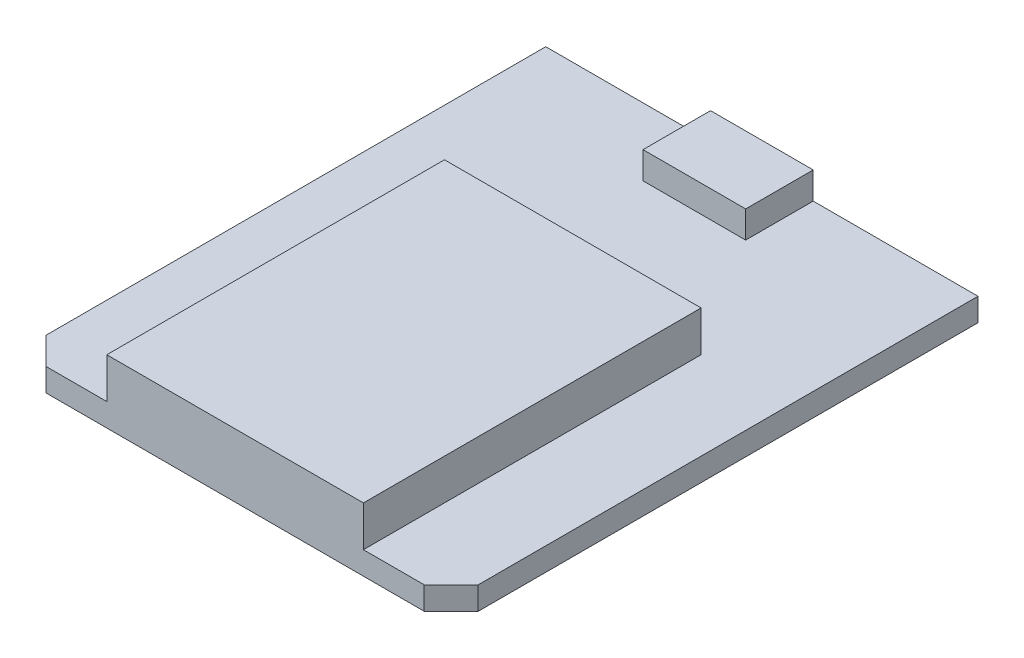
ISO-10303-21;
HEADER;
FILE_DESCRIPTION(('STEP AP214'),'2;1');
FILE_NAME('part.step','',(''),(''),'','','');
FILE_SCHEMA(('AUTOMOTIVE_DESIGN { 1 0 10303 214 1 1 1 1 }'));
ENDSEC;
DATA;
#1=APPLICATION_CONTEXT('core data for automotive mechanical design processes');
#2=APPLICATION_PROTOCOL_DEFINITION('international standard','automotive_design',2000,#1);
#3=PRODUCT_CONTEXT('',#1,'mechanical');
#4=PRODUCT('Part','Part','',(#3));
#5=PRODUCT_RELATED_PRODUCT_CATEGORY('part','',(#4));
#6=PRODUCT_DEFINITION_FORMATION('','',#4);
#7=PRODUCT_DEFINITION_CONTEXT('part definition',#1,'design');
#8=PRODUCT_DEFINITION('design','',#6,#7);
#9=PRODUCT_DEFINITION_SHAPE('','',#8);
#10=(LENGTH_UNIT() NAMED_UNIT(*) SI_UNIT(.MILLI.,.METRE.));
#11=(NAMED_UNIT(*) PLANE_ANGLE_UNIT() SI_UNIT($,.RADIAN.));
#12=(NAMED_UNIT(*) SI_UNIT($,.STERADIAN.) SOLID_ANGLE_UNIT());
#13=UNCERTAINTY_MEASURE_WITH_UNIT(LENGTH_MEASURE(1.E-05),#10,'distance_accuracy_value','');
#14=(GEOMETRIC_REPRESENTATION_CONTEXT(3) GLOBAL_UNCERTAINTY_ASSIGNED_CONTEXT((#13)) GLOBAL_UNIT_ASSIGNED_CONTEXT((#10,
#11,#12)) REPRESENTATION_CONTEXT('',''));
#15=CARTESIAN_POINT('',(0.,0.,0.));
#16=DIRECTION('',(0.,0.,1.));
#17=DIRECTION('',(1.,0.,0.));
#18=AXIS2_PLACEMENT_3D('',#15,#16,#17);
#19=CARTESIAN_POINT('',(0.,1.7,0.));
#20=DIRECTION('',(0.,-1.,0.));
#21=DIRECTION('',(0.,0.,-1.));
#22=AXIS2_PLACEMENT_3D('',#19,#20,#21);
#23=PLANE('',#22);
#24=DIRECTION('',(0.,0.,1.));
#25=VECTOR('',#24,1.);
#26=CARTESIAN_POINT('',(12.2,1.7,-39.));
#27=LINE('',#26,#25);
#28=CARTESIAN_POINT('',(12.2,1.7,-39.));
#29=VERTEX_POINT('',#28);
#30=CARTESIAN_POINT('',(12.2,1.7,-34.));
#31=VERTEX_POINT('',#30);
#32=EDGE_CURVE('E162',#29,#31,#27,.T.);
#33=ORIENTED_EDGE('',*,*,#32,.F.);
#34=DIRECTION('',(-1.,0.,0.));
#35=VECTOR('',#34,1.);
#36=CARTESIAN_POINT('',(0.,1.7,-39.));
#37=LINE('',#36,#35);
#38=CARTESIAN_POINT('',(0.,1.7,-39.));
#39=VERTEX_POINT('',#38);
#40=EDGE_CURVE('E208',#29,#39,#37,.T.);
#41=ORIENTED_EDGE('',*,*,#40,.T.);
#42=DIRECTION('',(0.,0.,1.));
#43=VECTOR('',#42,1.);
#44=CARTESIAN_POINT('',(0.,1.7,0.));
#45=LINE('',#44,#43);
#46=CARTESIAN_POINT('',(0.,1.7,-2.00000000000001));
#47=VERTEX_POINT('',#46);
#48=EDGE_CURVE('E199',#39,#47,#45,.T.);
#49=ORIENTED_EDGE('',*,*,#48,.T.);
#50=DIRECTION('',(-0.707106781186546,0.,-0.707106781186549));
#51=VECTOR('',#50,1.);
#52=CARTESIAN_POINT('',(2.,1.7,0.));
#53=LINE('',#52,#51);
#54=CARTESIAN_POINT('',(2.,1.7,0.));
#55=VERTEX_POINT('',#54);
#56=EDGE_CURVE('E238',#47,#55,#53,.F.);
#57=ORIENTED_EDGE('',*,*,#56,.T.);
#58=DIRECTION('',(1.,0.,0.));
#59=VECTOR('',#58,1.);
#60=CARTESIAN_POINT('',(0.,1.7,0.));
#61=LINE('',#60,#59);
#62=CARTESIAN_POINT('',(6.49999999999999,1.7,0.));
#63=VERTEX_POINT('',#62);
#64=EDGE_CURVE('E204',#55,#63,#61,.T.);
#65=ORIENTED_EDGE('',*,*,#64,.T.);
#66=DIRECTION('',(0.,0.,1.));
#67=VECTOR('',#66,1.);
#68=CARTESIAN_POINT('',(6.49999999999999,1.7,0.));
#69=LINE('',#68,#67);
#70=CARTESIAN_POINT('',(6.49999999999999,1.7,-25.));
#71=VERTEX_POINT('',#70);
#72=EDGE_CURVE('E163',#71,#63,#69,.T.);
#73=ORIENTED_EDGE('',*,*,#72,.F.);
#74=DIRECTION('',(-1.,0.,0.));
#75=VECTOR('',#74,1.);
#76=CARTESIAN_POINT('',(6.49999999999999,1.7,-25.));
#77=LINE('',#76,#75);
#78=CARTESIAN_POINT('',(25.5,1.7,-25.));
#79=VERTEX_POINT('',#78);
#80=EDGE_CURVE('E176',#79,#71,#77,.T.);
#81=ORIENTED_EDGE('',*,*,#80,.F.);
#82=DIRECTION('',(0.,0.,-1.));
#83=VECTOR('',#82,1.);
#84=CARTESIAN_POINT('',(25.5,1.7,0.));
#85=LINE('',#84,#83);
#86=CARTESIAN_POINT('',(25.5,1.7,0.));
#87=VERTEX_POINT('',#86);
#88=EDGE_CURVE('E166',#87,#79,#85,.T.);
#89=ORIENTED_EDGE('',*,*,#88,.F.);
#90=CARTESIAN_POINT('',(30.,1.7,0.));
#91=VERTEX_POINT('',#90);
#92=EDGE_CURVE('E202',#87,#91,#61,.T.);
#93=ORIENTED_EDGE('',*,*,#92,.T.);
#94=DIRECTION('',(-0.707106781186549,0.,0.707106781186546));
#95=VECTOR('',#94,1.);
#96=CARTESIAN_POINT('',(32.,1.7,-2.));
#97=LINE('',#96,#95);
#98=CARTESIAN_POINT('',(32.,1.7,-2.));
#99=VERTEX_POINT('',#98);
#100=EDGE_CURVE('E50',#91,#99,#97,.F.);
#101=ORIENTED_EDGE('',*,*,#100,.T.);
#102=DIRECTION('',(0.,0.,-1.));
#103=VECTOR('',#102,1.);
#104=CARTESIAN_POINT('',(32.,1.7,0.));
#105=LINE('',#104,#103);
#106=CARTESIAN_POINT('',(32.,1.7,-39.));
#107=VERTEX_POINT('',#106);
#108=EDGE_CURVE('E206',#99,#107,#105,.T.);
#109=ORIENTED_EDGE('',*,*,#108,.T.);
#110=CARTESIAN_POINT('',(19.8,1.7,-39.));
#111=VERTEX_POINT('',#110);
#112=EDGE_CURVE('E209',#107,#111,#37,.T.);
#113=ORIENTED_EDGE('',*,*,#112,.T.);
#114=DIRECTION('',(0.,0.,-1.));
#115=VECTOR('',#114,1.);
#116=CARTESIAN_POINT('',(19.8,1.7,-39.));
#117=LINE('',#116,#115);
#118=CARTESIAN_POINT('',(19.8,1.7,-34.));
#119=VERTEX_POINT('',#118);
#120=EDGE_CURVE('E62',#119,#111,#117,.T.);
#121=ORIENTED_EDGE('',*,*,#120,.F.);
#122=DIRECTION('',(1.,0.,0.));
#123=VECTOR('',#122,1.);
#124=CARTESIAN_POINT('',(12.2,1.7,-34.));
#125=LINE('',#124,#123);
#126=EDGE_CURVE('E57',#31,#119,#125,.T.);
#127=ORIENTED_EDGE('',*,*,#126,.F.);
#128=EDGE_LOOP('',(#33,#41,#49,#57,#65,#73,#81,#89,#93,#101,#109,#113,#121,#127));
#129=FACE_BOUND('',#128,.T.);
#130=ADVANCED_FACE('F41',(#129),#23,.F.);
#131=CARTESIAN_POINT('',(0.,1.7,0.));
#132=DIRECTION('',(1.,0.,0.));
#133=DIRECTION('',(0.,0.,-1.));
#134=AXIS2_PLACEMENT_3D('',#131,#132,#133);
#135=PLANE('',#134);
#136=DIRECTION('',(0.,0.,1.));
#137=VECTOR('',#136,1.);
#138=CARTESIAN_POINT('',(0.,0.,0.));
#139=LINE('',#138,#137);
#140=CARTESIAN_POINT('',(0.,0.,-39.));
#141=VERTEX_POINT('',#140);
#142=CARTESIAN_POINT('',(0.,0.,-2.00000000000001));
#143=VERTEX_POINT('',#142);
#144=EDGE_CURVE('E198',#141,#143,#139,.T.);
#145=ORIENTED_EDGE('',*,*,#144,.T.);
#146=DIRECTION('',(0.,1.,0.));
#147=VECTOR('',#146,1.);
#148=CARTESIAN_POINT('',(0.,1.7,-2.00000000000001));
#149=LINE('',#148,#147);
#150=EDGE_CURVE('E11',#143,#47,#149,.T.);
#151=ORIENTED_EDGE('',*,*,#150,.T.);
#152=ORIENTED_EDGE('',*,*,#48,.F.);
#153=DIRECTION('',(0.,-1.,0.));
#154=VECTOR('',#153,1.);
#155=CARTESIAN_POINT('',(0.,1.7,-39.));
#156=LINE('',#155,#154);
#157=EDGE_CURVE('E211',#39,#141,#156,.T.);
#158=ORIENTED_EDGE('',*,*,#157,.T.);
#159=EDGE_LOOP('',(#145,#151,#152,#158));
#160=FACE_BOUND('',#159,.T.);
#161=ADVANCED_FACE('F264',(#160),#135,.F.);
#162=CARTESIAN_POINT('',(0.,1.7,0.));
#163=DIRECTION('',(0.,0.,-1.));
#164=DIRECTION('',(-1.,0.,0.));
#165=AXIS2_PLACEMENT_3D('',#162,#163,#164);
#166=PLANE('',#165);
#167=DIRECTION('',(1.,0.,0.));
#168=VECTOR('',#167,1.);
#169=CARTESIAN_POINT('',(0.,0.,0.));
#170=LINE('',#169,#168);
#171=CARTESIAN_POINT('',(2.,0.,0.));
#172=VERTEX_POINT('',#171);
#173=CARTESIAN_POINT('',(30.,0.,0.));
#174=VERTEX_POINT('',#173);
#175=EDGE_CURVE('E214',#172,#174,#170,.T.);
#176=ORIENTED_EDGE('',*,*,#175,.T.);
#177=DIRECTION('',(0.,1.,0.));
#178=VECTOR('',#177,1.);
#179=CARTESIAN_POINT('',(30.,1.7,0.));
#180=LINE('',#179,#178);
#181=EDGE_CURVE('E235',#174,#91,#180,.T.);
#182=ORIENTED_EDGE('',*,*,#181,.T.);
#183=ORIENTED_EDGE('',*,*,#92,.F.);
#184=DIRECTION('',(0.,-1.,0.));
#185=VECTOR('',#184,1.);
#186=CARTESIAN_POINT('',(25.5,4.7,0.));
#187=LINE('',#186,#185);
#188=CARTESIAN_POINT('',(25.5,4.7,0.));
#189=VERTEX_POINT('',#188);
#190=EDGE_CURVE('E192',#189,#87,#187,.T.);
#191=ORIENTED_EDGE('',*,*,#190,.F.);
#192=DIRECTION('',(1.,0.,0.));
#193=VECTOR('',#192,1.);
#194=CARTESIAN_POINT('',(6.49999999999999,4.7,0.));
#195=LINE('',#194,#193);
#196=CARTESIAN_POINT('',(6.49999999999999,4.7,0.));
#197=VERTEX_POINT('',#196);
#198=EDGE_CURVE('E175',#197,#189,#195,.T.);
#199=ORIENTED_EDGE('',*,*,#198,.F.);
#200=DIRECTION('',(0.,-1.,0.));
#201=VECTOR('',#200,1.);
#202=CARTESIAN_POINT('',(6.49999999999999,4.7,0.));
#203=LINE('',#202,#201);
#204=EDGE_CURVE('E195',#197,#63,#203,.T.);
#205=ORIENTED_EDGE('',*,*,#204,.T.);
#206=ORIENTED_EDGE('',*,*,#64,.F.);
#207=DIRECTION('',(0.,-1.,0.));
#208=VECTOR('',#207,1.);
#209=CARTESIAN_POINT('',(2.,1.7,0.));
#210=LINE('',#209,#208);
#211=EDGE_CURVE('E232',#55,#172,#210,.T.);
#212=ORIENTED_EDGE('',*,*,#211,.T.);
#213=EDGE_LOOP('',(#176,#182,#183,#191,#199,#205,#206,#212));
#214=FACE_BOUND('',#213,.T.);
#215=ADVANCED_FACE('F256',(#214),#166,.F.);
#216=CARTESIAN_POINT('',(32.,1.7,0.));
#217=DIRECTION('',(-1.,0.,0.));
#218=DIRECTION('',(0.,0.,1.));
#219=AXIS2_PLACEMENT_3D('',#216,#217,#218);
#220=PLANE('',#219);
#221=ORIENTED_EDGE('',*,*,#108,.F.);
#222=DIRECTION('',(0.,-1.,0.));
#223=VECTOR('',#222,1.);
#224=CARTESIAN_POINT('',(32.,1.7,-2.));
#225=LINE('',#224,#223);
#226=CARTESIAN_POINT('',(32.,0.,-2.));
#227=VERTEX_POINT('',#226);
#228=EDGE_CURVE('E225',#99,#227,#225,.T.);
#229=ORIENTED_EDGE('',*,*,#228,.T.);
#230=DIRECTION('',(0.,0.,-1.));
#231=VECTOR('',#230,1.);
#232=CARTESIAN_POINT('',(32.,0.,0.));
#233=LINE('',#232,#231);
#234=CARTESIAN_POINT('',(32.,0.,-39.));
#235=VERTEX_POINT('',#234);
#236=EDGE_CURVE('E217',#227,#235,#233,.T.);
#237=ORIENTED_EDGE('',*,*,#236,.T.);
#238=DIRECTION('',(0.,-1.,0.));
#239=VECTOR('',#238,1.);
#240=CARTESIAN_POINT('',(32.,1.7,-39.));
#241=LINE('',#240,#239);
#242=EDGE_CURVE('E222',#107,#235,#241,.T.);
#243=ORIENTED_EDGE('',*,*,#242,.F.);
#244=EDGE_LOOP('',(#221,#229,#237,#243));
#245=FACE_BOUND('',#244,.T.);
#246=ADVANCED_FACE('F247',(#245),#220,.F.);
#247=CARTESIAN_POINT('',(0.,1.7,-39.));
#248=DIRECTION('',(0.,0.,1.));
#249=DIRECTION('',(1.,0.,0.));
#250=AXIS2_PLACEMENT_3D('',#247,#248,#249);
#251=PLANE('',#250);
#252=DIRECTION('',(-1.,0.,0.));
#253=VECTOR('',#252,1.);
#254=CARTESIAN_POINT('',(0.,0.,-39.));
#255=LINE('',#254,#253);
#256=EDGE_CURVE('E203',#235,#141,#255,.T.);
#257=ORIENTED_EDGE('',*,*,#256,.T.);
#258=ORIENTED_EDGE('',*,*,#157,.F.);
#259=ORIENTED_EDGE('',*,*,#40,.F.);
#260=DIRECTION('',(0.,-1.,0.));
#261=VECTOR('',#260,1.);
#262=CARTESIAN_POINT('',(12.2,3.7,-39.));
#263=LINE('',#262,#261);
#264=CARTESIAN_POINT('',(12.2,3.7,-39.));
#265=VERTEX_POINT('',#264);
#266=EDGE_CURVE('E277',#265,#29,#263,.T.);
#267=ORIENTED_EDGE('',*,*,#266,.F.);
#268=DIRECTION('',(-1.,0.,0.));
#269=VECTOR('',#268,1.);
#270=CARTESIAN_POINT('',(12.2,3.7,-39.));
#271=LINE('',#270,#269);
#272=CARTESIAN_POINT('',(19.8,3.7,-39.));
#273=VERTEX_POINT('',#272);
#274=EDGE_CURVE('E156',#273,#265,#271,.T.);
#275=ORIENTED_EDGE('',*,*,#274,.F.);
#276=DIRECTION('',(0.,-1.,0.));
#277=VECTOR('',#276,1.);
#278=CARTESIAN_POINT('',(19.8,3.7,-39.));
#279=LINE('',#278,#277);
#280=EDGE_CURVE('E168',#273,#111,#279,.T.);
#281=ORIENTED_EDGE('',*,*,#280,.T.);
#282=ORIENTED_EDGE('',*,*,#112,.F.);
#283=ORIENTED_EDGE('',*,*,#242,.T.);
#284=EDGE_LOOP('',(#257,#258,#259,#267,#275,#281,#282,#283));
#285=FACE_BOUND('',#284,.T.);
#286=ADVANCED_FACE('F268',(#285),#251,.F.);
#287=CARTESIAN_POINT('',(0.,0.,0.));
#288=DIRECTION('',(0.,-1.,0.));
#289=DIRECTION('',(0.,0.,-1.));
#290=AXIS2_PLACEMENT_3D('',#287,#288,#289);
#291=PLANE('',#290);
#292=ORIENTED_EDGE('',*,*,#236,.F.);
#293=DIRECTION('',(0.707106781186549,0.,-0.707106781186546));
#294=VECTOR('',#293,1.);
#295=CARTESIAN_POINT('',(14.9999999999999,0.,15.));
#296=LINE('',#295,#294);
#297=EDGE_CURVE('E230',#227,#174,#296,.F.);
#298=ORIENTED_EDGE('',*,*,#297,.T.);
#299=ORIENTED_EDGE('',*,*,#175,.F.);
#300=DIRECTION('',(0.707106781186546,0.,0.707106781186549));
#301=VECTOR('',#300,1.);
#302=CARTESIAN_POINT('',(1.,0.,-1.));
#303=LINE('',#302,#301);
#304=EDGE_CURVE('E228',#172,#143,#303,.F.);
#305=ORIENTED_EDGE('',*,*,#304,.T.);
#306=ORIENTED_EDGE('',*,*,#144,.F.);
#307=ORIENTED_EDGE('',*,*,#256,.F.);
#308=EDGE_LOOP('',(#292,#298,#299,#305,#306,#307));
#309=FACE_BOUND('',#308,.T.);
#310=ADVANCED_FACE('F253',(#309),#291,.T.);
#311=CARTESIAN_POINT('',(32.,1.7,-2.));
#312=DIRECTION('',(-0.707106781186546,0.,-0.707106781186549));
#313=DIRECTION('',(0.,-1.,0.));
#314=AXIS2_PLACEMENT_3D('',#311,#312,#313);
#315=PLANE('',#314);
#316=ORIENTED_EDGE('',*,*,#100,.F.);
#317=ORIENTED_EDGE('',*,*,#181,.F.);
#318=ORIENTED_EDGE('',*,*,#297,.F.);
#319=ORIENTED_EDGE('',*,*,#228,.F.);
#320=EDGE_LOOP('',(#316,#317,#318,#319));
#321=FACE_BOUND('',#320,.T.);
#322=ADVANCED_FACE('F250',(#321),#315,.F.);
#323=CARTESIAN_POINT('',(2.,1.7,0.));
#324=DIRECTION('',(0.707106781186549,0.,-0.707106781186546));
#325=DIRECTION('',(0.,-1.,0.));
#326=AXIS2_PLACEMENT_3D('',#323,#324,#325);
#327=PLANE('',#326);
#328=ORIENTED_EDGE('',*,*,#56,.F.);
#329=ORIENTED_EDGE('',*,*,#150,.F.);
#330=ORIENTED_EDGE('',*,*,#304,.F.);
#331=ORIENTED_EDGE('',*,*,#211,.F.);
#332=EDGE_LOOP('',(#328,#329,#330,#331));
#333=FACE_BOUND('',#332,.T.);
#334=ADVANCED_FACE('F44',(#333),#327,.F.);
#335=CARTESIAN_POINT('',(6.49999999999999,4.7,0.));
#336=DIRECTION('',(1.,0.,0.));
#337=DIRECTION('',(0.,0.,-1.));
#338=AXIS2_PLACEMENT_3D('',#335,#336,#337);
#339=PLANE('',#338);
#340=ORIENTED_EDGE('',*,*,#72,.T.);
#341=ORIENTED_EDGE('',*,*,#204,.F.);
#342=DIRECTION('',(0.,0.,1.));
#343=VECTOR('',#342,1.);
#344=CARTESIAN_POINT('',(6.49999999999999,4.7,0.));
#345=LINE('',#344,#343);
#346=CARTESIAN_POINT('',(6.49999999999999,4.7,-25.));
#347=VERTEX_POINT('',#346);
#348=EDGE_CURVE('E172',#347,#197,#345,.T.);
#349=ORIENTED_EDGE('',*,*,#348,.F.);
#350=DIRECTION('',(0.,-1.,0.));
#351=VECTOR('',#350,1.);
#352=CARTESIAN_POINT('',(6.49999999999999,4.7,-25.));
#353=LINE('',#352,#351);
#354=EDGE_CURVE('E181',#347,#71,#353,.T.);
#355=ORIENTED_EDGE('',*,*,#354,.T.);
#356=EDGE_LOOP('',(#340,#341,#349,#355));
#357=FACE_BOUND('',#356,.T.);
#358=ADVANCED_FACE('F296',(#357),#339,.F.);
#359=CARTESIAN_POINT('',(25.5,4.7,0.));
#360=DIRECTION('',(-1.,0.,0.));
#361=DIRECTION('',(0.,0.,1.));
#362=AXIS2_PLACEMENT_3D('',#359,#360,#361);
#363=PLANE('',#362);
#364=ORIENTED_EDGE('',*,*,#88,.T.);
#365=DIRECTION('',(0.,-1.,0.));
#366=VECTOR('',#365,1.);
#367=CARTESIAN_POINT('',(25.5,4.7,-25.));
#368=LINE('',#367,#366);
#369=CARTESIAN_POINT('',(25.5,4.7,-25.));
#370=VERTEX_POINT('',#369);
#371=EDGE_CURVE('E189',#370,#79,#368,.T.);
#372=ORIENTED_EDGE('',*,*,#371,.F.);
#373=DIRECTION('',(0.,0.,-1.));
#374=VECTOR('',#373,1.);
#375=CARTESIAN_POINT('',(25.5,4.7,0.));
#376=LINE('',#375,#374);
#377=EDGE_CURVE('E178',#189,#370,#376,.T.);
#378=ORIENTED_EDGE('',*,*,#377,.F.);
#379=ORIENTED_EDGE('',*,*,#190,.T.);
#380=EDGE_LOOP('',(#364,#372,#378,#379));
#381=FACE_BOUND('',#380,.T.);
#382=ADVANCED_FACE('F315',(#381),#363,.F.);
#383=CARTESIAN_POINT('',(6.49999999999999,4.7,-25.));
#384=DIRECTION('',(0.,0.,1.));
#385=DIRECTION('',(1.,0.,0.));
#386=AXIS2_PLACEMENT_3D('',#383,#384,#385);
#387=PLANE('',#386);
#388=ORIENTED_EDGE('',*,*,#80,.T.);
#389=ORIENTED_EDGE('',*,*,#354,.F.);
#390=DIRECTION('',(-1.,0.,0.));
#391=VECTOR('',#390,1.);
#392=CARTESIAN_POINT('',(6.49999999999999,4.7,-25.));
#393=LINE('',#392,#391);
#394=EDGE_CURVE('E180',#370,#347,#393,.T.);
#395=ORIENTED_EDGE('',*,*,#394,.F.);
#396=ORIENTED_EDGE('',*,*,#371,.T.);
#397=EDGE_LOOP('',(#388,#389,#395,#396));
#398=FACE_BOUND('',#397,.T.);
#399=ADVANCED_FACE('F320',(#398),#387,.F.);
#400=CARTESIAN_POINT('',(0.,4.7,0.));
#401=DIRECTION('',(0.,-1.,0.));
#402=DIRECTION('',(0.,0.,-1.));
#403=AXIS2_PLACEMENT_3D('',#400,#401,#402);
#404=PLANE('',#403);
#405=ORIENTED_EDGE('',*,*,#348,.T.);
#406=ORIENTED_EDGE('',*,*,#198,.T.);
#407=ORIENTED_EDGE('',*,*,#377,.T.);
#408=ORIENTED_EDGE('',*,*,#394,.T.);
#409=EDGE_LOOP('',(#405,#406,#407,#408));
#410=FACE_BOUND('',#409,.T.);
#411=ADVANCED_FACE('F331',(#410),#404,.F.);
#412=CARTESIAN_POINT('',(12.2,3.7,-39.));
#413=DIRECTION('',(1.,0.,0.));
#414=DIRECTION('',(0.,0.,-1.));
#415=AXIS2_PLACEMENT_3D('',#412,#413,#414);
#416=PLANE('',#415);
#417=ORIENTED_EDGE('',*,*,#32,.T.);
#418=DIRECTION('',(0.,-1.,0.));
#419=VECTOR('',#418,1.);
#420=CARTESIAN_POINT('',(12.2,3.7,-34.));
#421=LINE('',#420,#419);
#422=CARTESIAN_POINT('',(12.2,3.7,-34.));
#423=VERTEX_POINT('',#422);
#424=EDGE_CURVE('E144',#423,#31,#421,.T.);
#425=ORIENTED_EDGE('',*,*,#424,.F.);
#426=DIRECTION('',(0.,0.,1.));
#427=VECTOR('',#426,1.);
#428=CARTESIAN_POINT('',(12.2,3.7,-39.));
#429=LINE('',#428,#427);
#430=EDGE_CURVE('E151',#265,#423,#429,.T.);
#431=ORIENTED_EDGE('',*,*,#430,.F.);
#432=ORIENTED_EDGE('',*,*,#266,.T.);
#433=EDGE_LOOP('',(#417,#425,#431,#432));
#434=FACE_BOUND('',#433,.T.);
#435=ADVANCED_FACE('F161',(#434),#416,.F.);
#436=CARTESIAN_POINT('',(12.2,3.7,-34.));
#437=DIRECTION('',(0.,0.,-1.));
#438=DIRECTION('',(-1.,0.,0.));
#439=AXIS2_PLACEMENT_3D('',#436,#437,#438);
#440=PLANE('',#439);
#441=ORIENTED_EDGE('',*,*,#126,.T.);
#442=DIRECTION('',(0.,-1.,0.));
#443=VECTOR('',#442,1.);
#444=CARTESIAN_POINT('',(19.8,3.7,-34.));
#445=LINE('',#444,#443);
#446=CARTESIAN_POINT('',(19.8,3.7,-34.));
#447=VERTEX_POINT('',#446);
#448=EDGE_CURVE('E147',#447,#119,#445,.T.);
#449=ORIENTED_EDGE('',*,*,#448,.F.);
#450=DIRECTION('',(1.,0.,0.));
#451=VECTOR('',#450,1.);
#452=CARTESIAN_POINT('',(12.2,3.7,-34.));
#453=LINE('',#452,#451);
#454=EDGE_CURVE('E140',#423,#447,#453,.T.);
#455=ORIENTED_EDGE('',*,*,#454,.F.);
#456=ORIENTED_EDGE('',*,*,#424,.T.);
#457=EDGE_LOOP('',(#441,#449,#455,#456));
#458=FACE_BOUND('',#457,.T.);
#459=ADVANCED_FACE('F142',(#458),#440,.F.);
#460=CARTESIAN_POINT('',(19.8,3.7,-39.));
#461=DIRECTION('',(-1.,0.,0.));
#462=DIRECTION('',(0.,0.,1.));
#463=AXIS2_PLACEMENT_3D('',#460,#461,#462);
#464=PLANE('',#463);
#465=ORIENTED_EDGE('',*,*,#120,.T.);
#466=ORIENTED_EDGE('',*,*,#280,.F.);
#467=DIRECTION('',(0.,0.,-1.));
#468=VECTOR('',#467,1.);
#469=CARTESIAN_POINT('',(19.8,3.7,-39.));
#470=LINE('',#469,#468);
#471=EDGE_CURVE('E150',#447,#273,#470,.T.);
#472=ORIENTED_EDGE('',*,*,#471,.F.);
#473=ORIENTED_EDGE('',*,*,#448,.T.);
#474=EDGE_LOOP('',(#465,#466,#472,#473));
#475=FACE_BOUND('',#474,.T.);
#476=ADVANCED_FACE('F272',(#475),#464,.F.);
#477=CARTESIAN_POINT('',(0.,3.7,0.));
#478=DIRECTION('',(0.,1.,0.));
#479=DIRECTION('',(0.,0.,1.));
#480=AXIS2_PLACEMENT_3D('',#477,#478,#479);
#481=PLANE('',#480);
#482=ORIENTED_EDGE('',*,*,#430,.T.);
#483=ORIENTED_EDGE('',*,*,#454,.T.);
#484=ORIENTED_EDGE('',*,*,#471,.T.);
#485=ORIENTED_EDGE('',*,*,#274,.T.);
#486=EDGE_LOOP('',(#482,#483,#484,#485));
#487=FACE_BOUND('',#486,.T.);
#488=ADVANCED_FACE('F154',(#487),#481,.T.);
#489=CLOSED_SHELL('',(#130,#161,#215,#246,#286,#310,#322,#334,#358,#382,#399,#411,#435,#459,
#476,#488));
#490=MANIFOLD_SOLID_BREP('B2',#489);
#491=ADVANCED_BREP_SHAPE_REPRESENTATION('',(#18,#490),#14);
#492=SHAPE_DEFINITION_REPRESENTATION(#9,#491);
ENDSEC;
END-ISO-10303-21;
